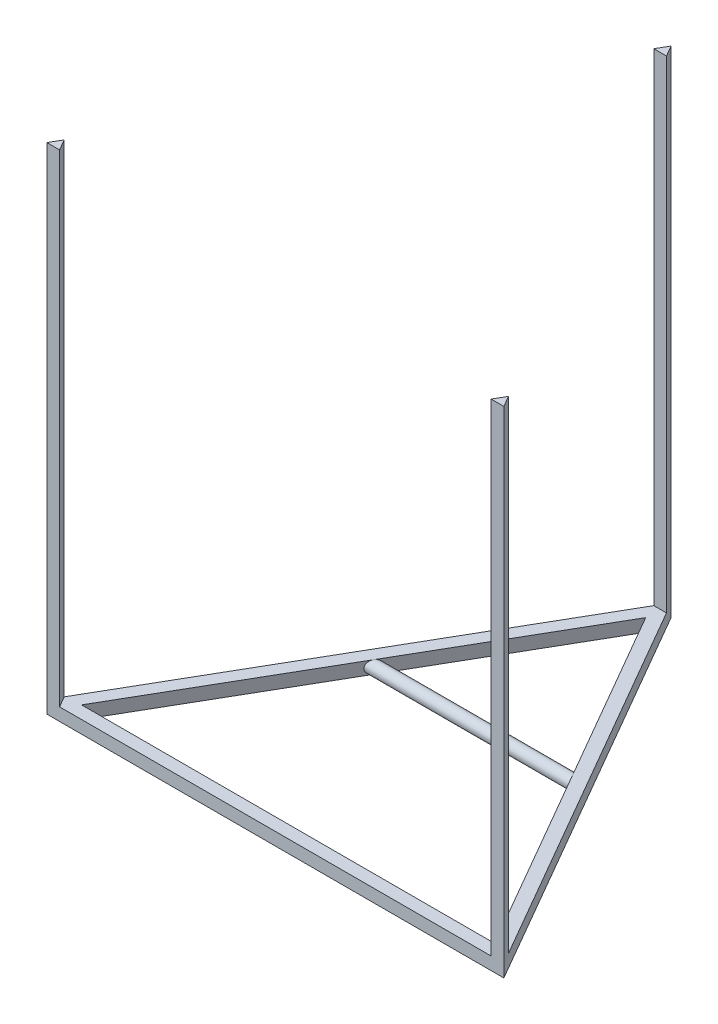
ISO-10303-21;
HEADER;
FILE_DESCRIPTION(('STEP AP214'),'2;1');
FILE_NAME('part.step','',(''),(''),'','','');
FILE_SCHEMA(('AUTOMOTIVE_DESIGN { 1 0 10303 214 1 1 1 1 }'));
ENDSEC;
DATA;
#1=APPLICATION_CONTEXT('core data for automotive mechanical design processes');
#2=APPLICATION_PROTOCOL_DEFINITION('international standard','automotive_design',2000,#1);
#3=PRODUCT_CONTEXT('',#1,'mechanical');
#4=PRODUCT('Part','Part','',(#3));
#5=PRODUCT_RELATED_PRODUCT_CATEGORY('part','',(#4));
#6=PRODUCT_DEFINITION_FORMATION('','',#4);
#7=PRODUCT_DEFINITION_CONTEXT('part definition',#1,'design');
#8=PRODUCT_DEFINITION('design','',#6,#7);
#9=PRODUCT_DEFINITION_SHAPE('','',#8);
#10=(LENGTH_UNIT() NAMED_UNIT(*) SI_UNIT(.MILLI.,.METRE.));
#11=(NAMED_UNIT(*) PLANE_ANGLE_UNIT() SI_UNIT($,.RADIAN.));
#12=(NAMED_UNIT(*) SI_UNIT($,.STERADIAN.) SOLID_ANGLE_UNIT());
#13=UNCERTAINTY_MEASURE_WITH_UNIT(LENGTH_MEASURE(1.E-05),#10,'distance_accuracy_value','');
#14=(GEOMETRIC_REPRESENTATION_CONTEXT(3) GLOBAL_UNCERTAINTY_ASSIGNED_CONTEXT((#13)) GLOBAL_UNIT_ASSIGNED_CONTEXT((#10,
#11,#12)) REPRESENTATION_CONTEXT('',''));
#15=CARTESIAN_POINT('',(0.,0.,0.));
#16=DIRECTION('',(0.,0.,1.));
#17=DIRECTION('',(1.,0.,0.));
#18=AXIS2_PLACEMENT_3D('',#15,#16,#17);
#19=CARTESIAN_POINT('',(17.3205080756893,10.,-10.));
#20=DIRECTION('',(-0.866025403784442,0.,-0.499999999999995));
#21=DIRECTION('',(-0.499999999999995,0.,0.866025403784442));
#22=AXIS2_PLACEMENT_3D('',#19,#20,#21);
#23=PLANE('',#22);
#24=DIRECTION('',(0.499999999999995,0.,-0.866025403784441));
#25=VECTOR('',#24,1.);
#26=CARTESIAN_POINT('',(17.3205080756893,10.,-10.));
#27=LINE('',#26,#25);
#28=CARTESIAN_POINT('',(101.613647377369,10.0000000000003,-155.999999999992));
#29=VERTEX_POINT('',#28);
#30=CARTESIAN_POINT('',(179.999999999999,10.,-291.7691453624));
#31=VERTEX_POINT('',#30);
#32=EDGE_CURVE('E162',#29,#31,#27,.T.);
#33=ORIENTED_EDGE('',*,*,#32,.F.);
#34=CARTESIAN_POINT('',(101.613647377369,5.00000000000026,-155.999999999992));
#35=DIRECTION('',(-0.866025403784442,0.,-0.499999999999995));
#36=DIRECTION('',(-0.499999999999995,0.,0.866025403784442));
#37=AXIS2_PLACEMENT_3D('',#34,#35,#36);
#38=ELLIPSE('',#37,5.77350269189597,4.99999999999999);
#39=CARTESIAN_POINT('',(101.613647377369,2.70616862252382E-13,-155.999999999992));
#40=VERTEX_POINT('',#39);
#41=EDGE_CURVE('E50',#29,#40,#38,.T.);
#42=ORIENTED_EDGE('',*,*,#41,.T.);
#43=DIRECTION('',(0.499999999999995,0.,-0.866025403784441));
#44=VECTOR('',#43,1.);
#45=CARTESIAN_POINT('',(17.3205080756893,0.,-10.));
#46=LINE('',#45,#44);
#47=CARTESIAN_POINT('',(179.999999999999,0.,-291.7691453624));
#48=VERTEX_POINT('',#47);
#49=EDGE_CURVE('E309',#40,#48,#46,.T.);
#50=ORIENTED_EDGE('',*,*,#49,.T.);
#51=DIRECTION('',(0.,-1.,0.));
#52=VECTOR('',#51,1.);
#53=CARTESIAN_POINT('',(179.999999999999,10.,-291.7691453624));
#54=LINE('',#53,#52);
#55=EDGE_CURVE('E161',#31,#48,#54,.T.);
#56=ORIENTED_EDGE('',*,*,#55,.F.);
#57=EDGE_LOOP('',(#33,#42,#50,#56));
#58=FACE_BOUND('',#57,.T.);
#59=ADVANCED_FACE('F36',(#58),#23,.F.);
#60=CARTESIAN_POINT('',(179.999999999999,10.,-291.7691453624));
#61=DIRECTION('',(0.86602540378444,0.,-0.499999999999998));
#62=DIRECTION('',(-0.499999999999998,0.,-0.86602540378444));
#63=AXIS2_PLACEMENT_3D('',#60,#61,#62);
#64=PLANE('',#63);
#65=DIRECTION('',(0.499999999999998,0.,0.86602540378444));
#66=VECTOR('',#65,1.);
#67=CARTESIAN_POINT('',(179.999999999999,10.,-291.7691453624));
#68=LINE('',#67,#66);
#69=CARTESIAN_POINT('',(258.386352622637,10.0000000000007,-155.99999999998));
#70=VERTEX_POINT('',#69);
#71=CARTESIAN_POINT('',(342.679491924311,10.,-10.));
#72=VERTEX_POINT('',#71);
#73=EDGE_CURVE('E144',#70,#72,#68,.T.);
#74=ORIENTED_EDGE('',*,*,#73,.F.);
#75=CARTESIAN_POINT('',(258.386352622637,5.0000000000007,-155.99999999998));
#76=DIRECTION('',(0.86602540378444,0.,-0.499999999999998));
#77=DIRECTION('',(-0.499999999999998,0.,-0.86602540378444));
#78=AXIS2_PLACEMENT_3D('',#75,#76,#77);
#79=ELLIPSE('',#78,5.7735026918965,4.99999999999999);
#80=CARTESIAN_POINT('',(258.386352622637,7.06899816460549E-13,-155.99999999998));
#81=VERTEX_POINT('',#80);
#82=EDGE_CURVE('E11',#70,#81,#79,.T.);
#83=ORIENTED_EDGE('',*,*,#82,.T.);
#84=DIRECTION('',(0.499999999999998,0.,0.86602540378444));
#85=VECTOR('',#84,1.);
#86=CARTESIAN_POINT('',(179.999999999999,0.,-291.7691453624));
#87=LINE('',#86,#85);
#88=CARTESIAN_POINT('',(342.679491924311,0.,-10.));
#89=VERTEX_POINT('',#88);
#90=EDGE_CURVE('E142',#81,#89,#87,.T.);
#91=ORIENTED_EDGE('',*,*,#90,.T.);
#92=DIRECTION('',(0.,-1.,0.));
#93=VECTOR('',#92,1.);
#94=CARTESIAN_POINT('',(342.679491924311,10.,-10.));
#95=LINE('',#94,#93);
#96=EDGE_CURVE('E170',#72,#89,#95,.T.);
#97=ORIENTED_EDGE('',*,*,#96,.F.);
#98=EDGE_LOOP('',(#74,#83,#91,#97));
#99=FACE_BOUND('',#98,.T.);
#100=ADVANCED_FACE('F140',(#99),#64,.F.);
#101=CARTESIAN_POINT('',(0.,10.,0.));
#102=DIRECTION('',(0.,-1.,0.));
#103=DIRECTION('',(0.,0.,-1.));
#104=AXIS2_PLACEMENT_3D('',#101,#102,#103);
#105=PLANE('',#104);
#106=EDGE_CURVE('E315',#31,#70,#68,.T.);
#107=ORIENTED_EDGE('',*,*,#106,.T.);
#108=ORIENTED_EDGE('',*,*,#73,.T.);
#109=DIRECTION('',(-1.,0.,0.));
#110=VECTOR('',#109,1.);
#111=CARTESIAN_POINT('',(342.679491924311,10.,-10.));
#112=LINE('',#111,#110);
#113=CARTESIAN_POINT('',(17.3205080756893,10.,-10.));
#114=VERTEX_POINT('',#113);
#115=EDGE_CURVE('E173',#72,#114,#112,.T.);
#116=ORIENTED_EDGE('',*,*,#115,.T.);
#117=EDGE_CURVE('E312',#114,#29,#27,.T.);
#118=ORIENTED_EDGE('',*,*,#117,.T.);
#119=ORIENTED_EDGE('',*,*,#32,.T.);
#120=EDGE_LOOP('',(#107,#108,#116,#118,#119));
#121=FACE_BOUND('',#120,.T.);
#122=DIRECTION('',(1.,0.,0.));
#123=VECTOR('',#122,1.);
#124=CARTESIAN_POINT('',(175.,10.,-303.108891324555));
#125=LINE('',#124,#123);
#126=CARTESIAN_POINT('',(175.,10.,-303.108891324555));
#127=VERTEX_POINT('',#126);
#128=CARTESIAN_POINT('',(185.,10.,-303.108891324555));
#129=VERTEX_POINT('',#128);
#130=EDGE_CURVE('E169',#127,#129,#125,.T.);
#131=ORIENTED_EDGE('',*,*,#130,.F.);
#132=DIRECTION('',(-0.499999999999998,0.,0.86602540378444));
#133=VECTOR('',#132,1.);
#134=CARTESIAN_POINT('',(0.,10.,0.));
#135=LINE('',#134,#133);
#136=CARTESIAN_POINT('',(4.99999999999996,10.,-8.66025403784438));
#137=VERTEX_POINT('',#136);
#138=EDGE_CURVE('E223',#127,#137,#135,.T.);
#139=ORIENTED_EDGE('',*,*,#138,.T.);
#140=DIRECTION('',(-0.500000000000005,0.,-0.866025403784436));
#141=VECTOR('',#140,1.);
#142=CARTESIAN_POINT('',(4.99999999999996,10.,-8.66025403784438));
#143=LINE('',#142,#141);
#144=CARTESIAN_POINT('',(10.,10.,0.));
#145=VERTEX_POINT('',#144);
#146=EDGE_CURVE('E189',#145,#137,#143,.T.);
#147=ORIENTED_EDGE('',*,*,#146,.F.);
#148=DIRECTION('',(1.,0.,0.));
#149=VECTOR('',#148,1.);
#150=CARTESIAN_POINT('',(0.,10.,0.));
#151=LINE('',#150,#149);
#152=CARTESIAN_POINT('',(350.,10.,0.));
#153=VERTEX_POINT('',#152);
#154=EDGE_CURVE('E225',#145,#153,#151,.T.);
#155=ORIENTED_EDGE('',*,*,#154,.T.);
#156=DIRECTION('',(-0.5,0.,0.866025403784438));
#157=VECTOR('',#156,1.);
#158=CARTESIAN_POINT('',(355.,10.,-8.66025403784438));
#159=LINE('',#158,#157);
#160=CARTESIAN_POINT('',(355.,10.,-8.6602540378443));
#161=VERTEX_POINT('',#160);
#162=EDGE_CURVE('E206',#161,#153,#159,.T.);
#163=ORIENTED_EDGE('',*,*,#162,.F.);
#164=DIRECTION('',(-0.499999999999998,0.,-0.86602540378444));
#165=VECTOR('',#164,1.);
#166=CARTESIAN_POINT('',(180.,10.,-311.7691453624));
#167=LINE('',#166,#165);
#168=EDGE_CURVE('E228',#161,#129,#167,.T.);
#169=ORIENTED_EDGE('',*,*,#168,.T.);
#170=EDGE_LOOP('',(#131,#139,#147,#155,#163,#169));
#171=FACE_BOUND('',#170,.T.);
#172=ADVANCED_FACE('F264',(#121,#171),#105,.F.);
#173=CARTESIAN_POINT('',(0.,10.,0.));
#174=DIRECTION('',(0.86602540378444,0.,0.499999999999998));
#175=DIRECTION('',(0.499999999999998,0.,-0.86602540378444));
#176=AXIS2_PLACEMENT_3D('',#173,#174,#175);
#177=PLANE('',#176);
#178=DIRECTION('',(-0.499999999999998,0.,0.86602540378444));
#179=VECTOR('',#178,1.);
#180=CARTESIAN_POINT('',(0.,0.,0.));
#181=LINE('',#180,#179);
#182=CARTESIAN_POINT('',(180.,0.,-311.7691453624));
#183=VERTEX_POINT('',#182);
#184=CARTESIAN_POINT('',(0.,0.,0.));
#185=VERTEX_POINT('',#184);
#186=EDGE_CURVE('E222',#183,#185,#181,.T.);
#187=ORIENTED_EDGE('',*,*,#186,.T.);
#188=DIRECTION('',(0.,-1.,0.));
#189=VECTOR('',#188,1.);
#190=CARTESIAN_POINT('',(0.,10.,0.));
#191=LINE('',#190,#189);
#192=CARTESIAN_POINT('',(0.,390.,0.));
#193=VERTEX_POINT('',#192);
#194=EDGE_CURVE('E137',#193,#185,#191,.T.);
#195=ORIENTED_EDGE('',*,*,#194,.F.);
#196=DIRECTION('',(-0.499999999999997,0.,0.86602540378444));
#197=VECTOR('',#196,1.);
#198=CARTESIAN_POINT('',(0.,390.,0.));
#199=LINE('',#198,#197);
#200=CARTESIAN_POINT('',(4.99999999999996,390.,-8.66025403784438));
#201=VERTEX_POINT('',#200);
#202=EDGE_CURVE('E195',#201,#193,#199,.T.);
#203=ORIENTED_EDGE('',*,*,#202,.F.);
#204=DIRECTION('',(0.,-1.,0.));
#205=VECTOR('',#204,1.);
#206=CARTESIAN_POINT('',(4.99999999999996,390.,-8.66025403784438));
#207=LINE('',#206,#205);
#208=EDGE_CURVE('E198',#201,#137,#207,.T.);
#209=ORIENTED_EDGE('',*,*,#208,.T.);
#210=ORIENTED_EDGE('',*,*,#138,.F.);
#211=DIRECTION('',(0.,-1.,0.));
#212=VECTOR('',#211,1.);
#213=CARTESIAN_POINT('',(175.,390.,-303.108891324555));
#214=LINE('',#213,#212);
#215=CARTESIAN_POINT('',(175.,390.,-303.108891324555));
#216=VERTEX_POINT('',#215);
#217=EDGE_CURVE('E186',#216,#127,#214,.T.);
#218=ORIENTED_EDGE('',*,*,#217,.F.);
#219=DIRECTION('',(-0.500000000000001,0.,0.866025403784438));
#220=VECTOR('',#219,1.);
#221=CARTESIAN_POINT('',(180.,390.,-311.7691453624));
#222=LINE('',#221,#220);
#223=CARTESIAN_POINT('',(180.,390.,-311.7691453624));
#224=VERTEX_POINT('',#223);
#225=EDGE_CURVE('E177',#224,#216,#222,.T.);
#226=ORIENTED_EDGE('',*,*,#225,.F.);
#227=DIRECTION('',(0.,-1.,0.));
#228=VECTOR('',#227,1.);
#229=CARTESIAN_POINT('',(180.,10.,-311.7691453624));
#230=LINE('',#229,#228);
#231=EDGE_CURVE('E230',#224,#183,#230,.T.);
#232=ORIENTED_EDGE('',*,*,#231,.T.);
#233=EDGE_LOOP('',(#187,#195,#203,#209,#210,#218,#226,#232));
#234=FACE_BOUND('',#233,.T.);
#235=ADVANCED_FACE('F38',(#234),#177,.F.);
#236=CARTESIAN_POINT('',(0.,10.,0.));
#237=DIRECTION('',(0.,0.,-1.));
#238=DIRECTION('',(-1.,0.,0.));
#239=AXIS2_PLACEMENT_3D('',#236,#237,#238);
#240=PLANE('',#239);
#241=DIRECTION('',(1.,0.,0.));
#242=VECTOR('',#241,1.);
#243=CARTESIAN_POINT('',(0.,0.,0.));
#244=LINE('',#243,#242);
#245=CARTESIAN_POINT('',(360.,0.,0.));
#246=VERTEX_POINT('',#245);
#247=EDGE_CURVE('E233',#185,#246,#244,.T.);
#248=ORIENTED_EDGE('',*,*,#247,.T.);
#249=DIRECTION('',(0.,-1.,0.));
#250=VECTOR('',#249,1.);
#251=CARTESIAN_POINT('',(360.,10.,0.));
#252=LINE('',#251,#250);
#253=CARTESIAN_POINT('',(360.,390.,0.));
#254=VERTEX_POINT('',#253);
#255=EDGE_CURVE('E238',#254,#246,#252,.T.);
#256=ORIENTED_EDGE('',*,*,#255,.F.);
#257=DIRECTION('',(1.,0.,0.));
#258=VECTOR('',#257,1.);
#259=CARTESIAN_POINT('',(350.,390.,0.));
#260=LINE('',#259,#258);
#261=CARTESIAN_POINT('',(350.,390.,0.));
#262=VERTEX_POINT('',#261);
#263=EDGE_CURVE('E207',#262,#254,#260,.T.);
#264=ORIENTED_EDGE('',*,*,#263,.F.);
#265=DIRECTION('',(0.,-1.,0.));
#266=VECTOR('',#265,1.);
#267=CARTESIAN_POINT('',(350.,390.,0.));
#268=LINE('',#267,#266);
#269=EDGE_CURVE('E214',#262,#153,#268,.T.);
#270=ORIENTED_EDGE('',*,*,#269,.T.);
#271=ORIENTED_EDGE('',*,*,#154,.F.);
#272=DIRECTION('',(0.,-1.,0.));
#273=VECTOR('',#272,1.);
#274=CARTESIAN_POINT('',(10.,390.,0.));
#275=LINE('',#274,#273);
#276=CARTESIAN_POINT('',(10.,390.,0.));
#277=VERTEX_POINT('',#276);
#278=EDGE_CURVE('E203',#277,#145,#275,.T.);
#279=ORIENTED_EDGE('',*,*,#278,.F.);
#280=DIRECTION('',(1.,0.,0.));
#281=VECTOR('',#280,1.);
#282=CARTESIAN_POINT('',(10.,390.,0.));
#283=LINE('',#282,#281);
#284=EDGE_CURVE('E190',#193,#277,#283,.T.);
#285=ORIENTED_EDGE('',*,*,#284,.F.);
#286=ORIENTED_EDGE('',*,*,#194,.T.);
#287=EDGE_LOOP('',(#248,#256,#264,#270,#271,#279,#285,#286));
#288=FACE_BOUND('',#287,.T.);
#289=ADVANCED_FACE('F243',(#288),#240,.F.);
#290=CARTESIAN_POINT('',(180.,10.,-311.7691453624));
#291=DIRECTION('',(-0.86602540378444,0.,0.499999999999998));
#292=DIRECTION('',(0.499999999999998,0.,0.86602540378444));
#293=AXIS2_PLACEMENT_3D('',#290,#291,#292);
#294=PLANE('',#293);
#295=DIRECTION('',(-0.499999999999998,0.,-0.86602540378444));
#296=VECTOR('',#295,1.);
#297=CARTESIAN_POINT('',(180.,0.,-311.7691453624));
#298=LINE('',#297,#296);
#299=EDGE_CURVE('E226',#246,#183,#298,.T.);
#300=ORIENTED_EDGE('',*,*,#299,.T.);
#301=ORIENTED_EDGE('',*,*,#231,.F.);
#302=DIRECTION('',(-0.499999999999932,0.,-0.866025403784478));
#303=VECTOR('',#302,1.);
#304=CARTESIAN_POINT('',(184.999999999999,390.,-303.108891324555));
#305=LINE('',#304,#303);
#306=CARTESIAN_POINT('',(184.999999999999,390.,-303.108891324555));
#307=VERTEX_POINT('',#306);
#308=EDGE_CURVE('E174',#307,#224,#305,.T.);
#309=ORIENTED_EDGE('',*,*,#308,.F.);
#310=DIRECTION('',(0.,-1.,0.));
#311=VECTOR('',#310,1.);
#312=CARTESIAN_POINT('',(184.999999999999,390.,-303.108891324555));
#313=LINE('',#312,#311);
#314=EDGE_CURVE('E181',#307,#129,#313,.T.);
#315=ORIENTED_EDGE('',*,*,#314,.T.);
#316=ORIENTED_EDGE('',*,*,#168,.F.);
#317=DIRECTION('',(0.,-1.,0.));
#318=VECTOR('',#317,1.);
#319=CARTESIAN_POINT('',(355.,390.,-8.66025403784438));
#320=LINE('',#319,#318);
#321=CARTESIAN_POINT('',(355.,390.,-8.66025403784438));
#322=VERTEX_POINT('',#321);
#323=EDGE_CURVE('E219',#322,#161,#320,.T.);
#324=ORIENTED_EDGE('',*,*,#323,.F.);
#325=DIRECTION('',(-0.5,0.,-0.866025403784439));
#326=VECTOR('',#325,1.);
#327=CARTESIAN_POINT('',(360.,390.,0.));
#328=LINE('',#327,#326);
#329=EDGE_CURVE('E210',#254,#322,#328,.T.);
#330=ORIENTED_EDGE('',*,*,#329,.F.);
#331=ORIENTED_EDGE('',*,*,#255,.T.);
#332=EDGE_LOOP('',(#300,#301,#309,#315,#316,#324,#330,#331));
#333=FACE_BOUND('',#332,.T.);
#334=ADVANCED_FACE('F251',(#333),#294,.F.);
#335=CARTESIAN_POINT('',(0.,0.,0.));
#336=DIRECTION('',(0.,-1.,0.));
#337=DIRECTION('',(0.,0.,-1.));
#338=AXIS2_PLACEMENT_3D('',#335,#336,#337);
#339=PLANE('',#338);
#340=ORIENTED_EDGE('',*,*,#90,.F.);
#341=EDGE_CURVE('E152',#48,#81,#87,.T.);
#342=ORIENTED_EDGE('',*,*,#341,.F.);
#343=ORIENTED_EDGE('',*,*,#49,.F.);
#344=CARTESIAN_POINT('',(17.3205080756893,0.,-10.));
#345=VERTEX_POINT('',#344);
#346=EDGE_CURVE('E156',#345,#40,#46,.T.);
#347=ORIENTED_EDGE('',*,*,#346,.F.);
#348=DIRECTION('',(-1.,0.,0.));
#349=VECTOR('',#348,1.);
#350=CARTESIAN_POINT('',(342.679491924311,0.,-10.));
#351=LINE('',#350,#349);
#352=EDGE_CURVE('E155',#89,#345,#351,.T.);
#353=ORIENTED_EDGE('',*,*,#352,.F.);
#354=EDGE_LOOP('',(#340,#342,#343,#347,#353));
#355=FACE_BOUND('',#354,.T.);
#356=ORIENTED_EDGE('',*,*,#186,.F.);
#357=ORIENTED_EDGE('',*,*,#299,.F.);
#358=ORIENTED_EDGE('',*,*,#247,.F.);
#359=EDGE_LOOP('',(#356,#357,#358));
#360=FACE_BOUND('',#359,.T.);
#361=ADVANCED_FACE('F149',(#355,#360),#339,.T.);
#362=CARTESIAN_POINT('',(355.,390.,-8.66025403784438));
#363=DIRECTION('',(0.866025403784438,0.,0.5));
#364=DIRECTION('',(0.5,0.,-0.866025403784438));
#365=AXIS2_PLACEMENT_3D('',#362,#363,#364);
#366=PLANE('',#365);
#367=ORIENTED_EDGE('',*,*,#162,.T.);
#368=ORIENTED_EDGE('',*,*,#269,.F.);
#369=DIRECTION('',(-0.5,0.,0.866025403784438));
#370=VECTOR('',#369,1.);
#371=CARTESIAN_POINT('',(355.,390.,-8.66025403784438));
#372=LINE('',#371,#370);
#373=EDGE_CURVE('E212',#322,#262,#372,.T.);
#374=ORIENTED_EDGE('',*,*,#373,.F.);
#375=ORIENTED_EDGE('',*,*,#323,.T.);
#376=EDGE_LOOP('',(#367,#368,#374,#375));
#377=FACE_BOUND('',#376,.T.);
#378=ADVANCED_FACE('F261',(#377),#366,.F.);
#379=CARTESIAN_POINT('',(0.,390.,0.));
#380=DIRECTION('',(0.,1.,0.));
#381=DIRECTION('',(0.,0.,1.));
#382=AXIS2_PLACEMENT_3D('',#379,#380,#381);
#383=PLANE('',#382);
#384=ORIENTED_EDGE('',*,*,#263,.T.);
#385=ORIENTED_EDGE('',*,*,#329,.T.);
#386=ORIENTED_EDGE('',*,*,#373,.T.);
#387=EDGE_LOOP('',(#384,#385,#386));
#388=FACE_BOUND('',#387,.T.);
#389=ADVANCED_FACE('F258',(#388),#383,.T.);
#390=CARTESIAN_POINT('',(4.99999999999996,390.,-8.66025403784438));
#391=DIRECTION('',(-0.866025403784436,0.,0.500000000000005));
#392=DIRECTION('',(0.500000000000005,0.,0.866025403784436));
#393=AXIS2_PLACEMENT_3D('',#390,#391,#392);
#394=PLANE('',#393);
#395=ORIENTED_EDGE('',*,*,#146,.T.);
#396=ORIENTED_EDGE('',*,*,#208,.F.);
#397=DIRECTION('',(-0.500000000000005,0.,-0.866025403784436));
#398=VECTOR('',#397,1.);
#399=CARTESIAN_POINT('',(4.99999999999996,390.,-8.66025403784438));
#400=LINE('',#399,#398);
#401=EDGE_CURVE('E193',#277,#201,#400,.T.);
#402=ORIENTED_EDGE('',*,*,#401,.F.);
#403=ORIENTED_EDGE('',*,*,#278,.T.);
#404=EDGE_LOOP('',(#395,#396,#402,#403));
#405=FACE_BOUND('',#404,.T.);
#406=ADVANCED_FACE('F274',(#405),#394,.F.);
#407=CARTESIAN_POINT('',(0.,390.,0.));
#408=DIRECTION('',(0.,-1.,0.));
#409=DIRECTION('',(0.,0.,-1.));
#410=AXIS2_PLACEMENT_3D('',#407,#408,#409);
#411=PLANE('',#410);
#412=ORIENTED_EDGE('',*,*,#284,.T.);
#413=ORIENTED_EDGE('',*,*,#401,.T.);
#414=ORIENTED_EDGE('',*,*,#202,.T.);
#415=EDGE_LOOP('',(#412,#413,#414));
#416=FACE_BOUND('',#415,.T.);
#417=ADVANCED_FACE('F276',(#416),#411,.F.);
#418=CARTESIAN_POINT('',(175.,390.,-303.108891324555));
#419=DIRECTION('',(0.,0.,-1.));
#420=DIRECTION('',(-1.,0.,0.));
#421=AXIS2_PLACEMENT_3D('',#418,#419,#420);
#422=PLANE('',#421);
#423=ORIENTED_EDGE('',*,*,#130,.T.);
#424=ORIENTED_EDGE('',*,*,#314,.F.);
#425=DIRECTION('',(1.,0.,0.));
#426=VECTOR('',#425,1.);
#427=CARTESIAN_POINT('',(175.,390.,-303.108891324555));
#428=LINE('',#427,#426);
#429=EDGE_CURVE('E179',#216,#307,#428,.T.);
#430=ORIENTED_EDGE('',*,*,#429,.F.);
#431=ORIENTED_EDGE('',*,*,#217,.T.);
#432=EDGE_LOOP('',(#423,#424,#430,#431));
#433=FACE_BOUND('',#432,.T.);
#434=ADVANCED_FACE('F269',(#433),#422,.F.);
#435=CARTESIAN_POINT('',(0.,390.,0.));
#436=DIRECTION('',(0.,1.,0.));
#437=DIRECTION('',(0.,0.,1.));
#438=AXIS2_PLACEMENT_3D('',#435,#436,#437);
#439=PLANE('',#438);
#440=ORIENTED_EDGE('',*,*,#308,.T.);
#441=ORIENTED_EDGE('',*,*,#225,.T.);
#442=ORIENTED_EDGE('',*,*,#429,.T.);
#443=EDGE_LOOP('',(#440,#441,#442));
#444=FACE_BOUND('',#443,.T.);
#445=ADVANCED_FACE('F283',(#444),#439,.T.);
#446=ORIENTED_EDGE('',*,*,#346,.T.);
#447=EDGE_CURVE('E308',#40,#29,#38,.T.);
#448=ORIENTED_EDGE('',*,*,#447,.T.);
#449=ORIENTED_EDGE('',*,*,#117,.F.);
#450=DIRECTION('',(0.,-1.,0.));
#451=VECTOR('',#450,1.);
#452=CARTESIAN_POINT('',(17.3205080756893,10.,-10.));
#453=LINE('',#452,#451);
#454=EDGE_CURVE('E167',#114,#345,#453,.T.);
#455=ORIENTED_EDGE('',*,*,#454,.T.);
#456=EDGE_LOOP('',(#446,#448,#449,#455));
#457=FACE_BOUND('',#456,.T.);
#458=ADVANCED_FACE('F289',(#457),#23,.F.);
#459=CARTESIAN_POINT('',(342.679491924311,10.,-10.));
#460=DIRECTION('',(0.,0.,1.));
#461=DIRECTION('',(1.,0.,0.));
#462=AXIS2_PLACEMENT_3D('',#459,#460,#461);
#463=PLANE('',#462);
#464=ORIENTED_EDGE('',*,*,#352,.T.);
#465=ORIENTED_EDGE('',*,*,#454,.F.);
#466=ORIENTED_EDGE('',*,*,#115,.F.);
#467=ORIENTED_EDGE('',*,*,#96,.T.);
#468=EDGE_LOOP('',(#464,#465,#466,#467));
#469=FACE_BOUND('',#468,.T.);
#470=ADVANCED_FACE('F298',(#469),#463,.F.);
#471=ORIENTED_EDGE('',*,*,#341,.T.);
#472=EDGE_CURVE('E40',#81,#70,#79,.T.);
#473=ORIENTED_EDGE('',*,*,#472,.T.);
#474=ORIENTED_EDGE('',*,*,#106,.F.);
#475=ORIENTED_EDGE('',*,*,#55,.T.);
#476=EDGE_LOOP('',(#471,#473,#474,#475));
#477=FACE_BOUND('',#476,.T.);
#478=ADVANCED_FACE('F159',(#477),#64,.F.);
#479=CARTESIAN_POINT('',(264.999999999989,5.00000000000072,-155.999999999979));
#480=DIRECTION('',(-1.,0.,0.));
#481=DIRECTION('',(0.,0.,1.));
#482=AXIS2_PLACEMENT_3D('',#479,#480,#481);
#483=CYLINDRICAL_SURFACE('',#482,4.99999999999999);
#484=ORIENTED_EDGE('',*,*,#82,.F.);
#485=ORIENTED_EDGE('',*,*,#472,.F.);
#486=EDGE_LOOP('',(#484,#485));
#487=FACE_BOUND('',#486,.T.);
#488=ORIENTED_EDGE('',*,*,#41,.F.);
#489=ORIENTED_EDGE('',*,*,#447,.F.);
#490=EDGE_LOOP('',(#488,#489));
#491=FACE_BOUND('',#490,.T.);
#492=ADVANCED_FACE('F132',(#487,#491),#483,.T.);
#493=CLOSED_SHELL('',(#59,#100,#172,#235,#289,#334,#361,#378,#389,#406,#417,#434,#445,#458,#470,
#478,#492));
#494=MANIFOLD_SOLID_BREP('B2',#493);
#495=ADVANCED_BREP_SHAPE_REPRESENTATION('',(#18,#494),#14);
#496=SHAPE_DEFINITION_REPRESENTATION(#9,#495);
ENDSEC;
END-ISO-10303-21;
